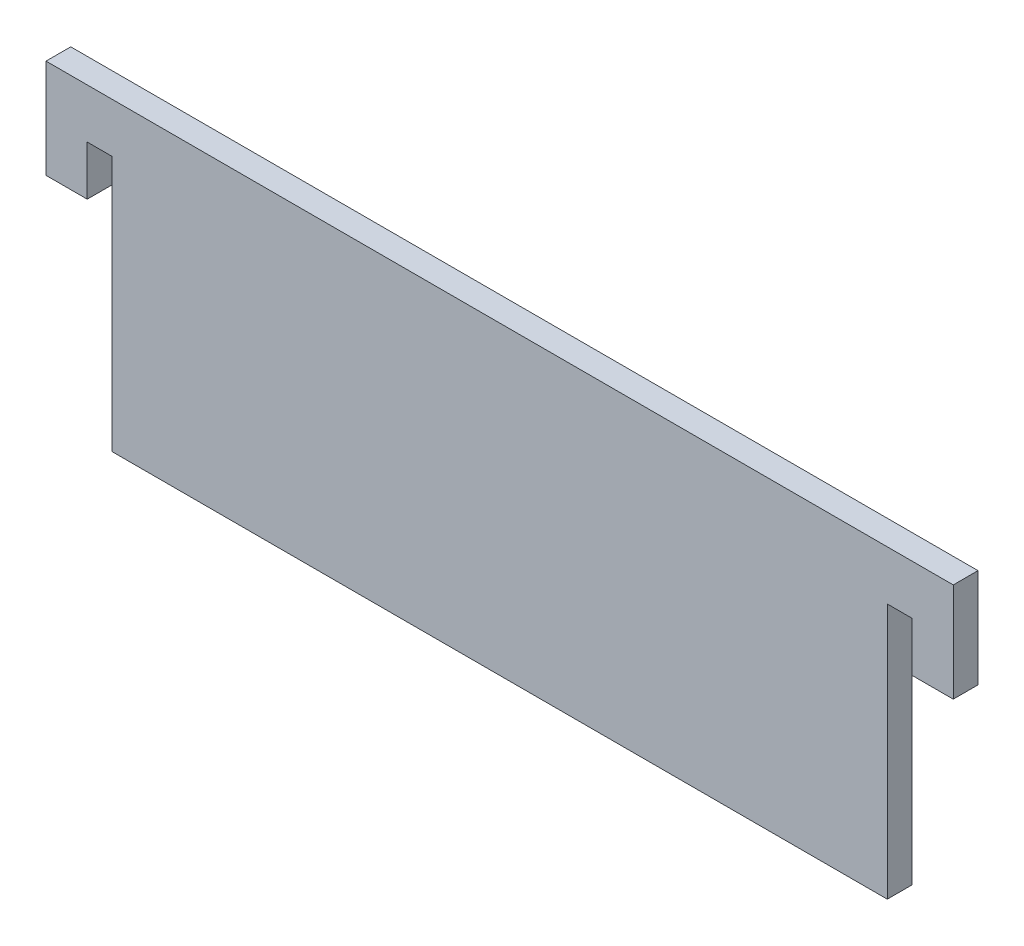
ISO-10303-21;
HEADER;
FILE_DESCRIPTION(('STEP AP214'),'2;1');
FILE_NAME('part.step','',(''),(''),'','','');
FILE_SCHEMA(('AUTOMOTIVE_DESIGN { 1 0 10303 214 1 1 1 1 }'));
ENDSEC;
DATA;
#1=APPLICATION_CONTEXT('core data for automotive mechanical design processes');
#2=APPLICATION_PROTOCOL_DEFINITION('international standard','automotive_design',2000,#1);
#3=PRODUCT_CONTEXT('',#1,'mechanical');
#4=PRODUCT('Part','Part','',(#3));
#5=PRODUCT_RELATED_PRODUCT_CATEGORY('part','',(#4));
#6=PRODUCT_DEFINITION_FORMATION('','',#4);
#7=PRODUCT_DEFINITION_CONTEXT('part definition',#1,'design');
#8=PRODUCT_DEFINITION('design','',#6,#7);
#9=PRODUCT_DEFINITION_SHAPE('','',#8);
#10=(LENGTH_UNIT() NAMED_UNIT(*) SI_UNIT(.MILLI.,.METRE.));
#11=(NAMED_UNIT(*) PLANE_ANGLE_UNIT() SI_UNIT($,.RADIAN.));
#12=(NAMED_UNIT(*) SI_UNIT($,.STERADIAN.) SOLID_ANGLE_UNIT());
#13=UNCERTAINTY_MEASURE_WITH_UNIT(LENGTH_MEASURE(1.E-05),#10,'distance_accuracy_value','');
#14=(GEOMETRIC_REPRESENTATION_CONTEXT(3) GLOBAL_UNCERTAINTY_ASSIGNED_CONTEXT((#13)) GLOBAL_UNIT_ASSIGNED_CONTEXT((#10,
#11,#12)) REPRESENTATION_CONTEXT('',''));
#15=CARTESIAN_POINT('',(0.,0.,0.));
#16=DIRECTION('',(0.,0.,1.));
#17=DIRECTION('',(1.,0.,0.));
#18=AXIS2_PLACEMENT_3D('',#15,#16,#17);
#19=CARTESIAN_POINT('',(-1.0429380677152E-13,15.4597593373967,3.));
#20=DIRECTION('',(0.,1.,0.));
#21=DIRECTION('',(-1.,0.,0.));
#22=AXIS2_PLACEMENT_3D('',#19,#20,#21);
#23=PLANE('',#22);
#24=DIRECTION('',(1.,0.,0.));
#25=VECTOR('',#24,1.);
#26=CARTESIAN_POINT('',(-1.0429380677152E-13,15.4597593373967,0.));
#27=LINE('',#26,#25);
#28=CARTESIAN_POINT('',(-46.7371115714815,15.4597593373964,0.));
#29=VERTEX_POINT('',#28);
#30=CARTESIAN_POINT('',(63.2628884285185,15.4597593373964,0.));
#31=VERTEX_POINT('',#30);
#32=EDGE_CURVE('E92',#29,#31,#27,.T.);
#33=ORIENTED_EDGE('',*,*,#32,.F.);
#34=DIRECTION('',(0.,0.,1.));
#35=VECTOR('',#34,1.);
#36=CARTESIAN_POINT('',(-46.7371115714815,15.4597593373964,0.));
#37=LINE('',#36,#35);
#38=CARTESIAN_POINT('',(-46.7371115714815,15.4597593373964,3.));
#39=VERTEX_POINT('',#38);
#40=EDGE_CURVE('E104',#29,#39,#37,.T.);
#41=ORIENTED_EDGE('',*,*,#40,.T.);
#42=DIRECTION('',(1.,0.,0.));
#43=VECTOR('',#42,1.);
#44=CARTESIAN_POINT('',(-1.13233275923364E-13,15.4597593373967,3.));
#45=LINE('',#44,#43);
#46=CARTESIAN_POINT('',(63.2628884285185,15.4597593373964,3.));
#47=VERTEX_POINT('',#46);
#48=EDGE_CURVE('E11',#39,#47,#45,.T.);
#49=ORIENTED_EDGE('',*,*,#48,.T.);
#50=DIRECTION('',(0.,0.,1.));
#51=VECTOR('',#50,1.);
#52=CARTESIAN_POINT('',(63.2628884285185,15.4597593373964,0.));
#53=LINE('',#52,#51);
#54=EDGE_CURVE('E99',#31,#47,#53,.T.);
#55=ORIENTED_EDGE('',*,*,#54,.F.);
#56=EDGE_LOOP('',(#33,#41,#49,#55));
#57=FACE_BOUND('',#56,.T.);
#58=ADVANCED_FACE('F35',(#57),#23,.T.);
#59=CARTESIAN_POINT('',(1.49465444622433E-13,-21.5402406626033,3.));
#60=DIRECTION('',(0.,1.,0.));
#61=DIRECTION('',(-1.,0.,0.));
#62=AXIS2_PLACEMENT_3D('',#59,#60,#61);
#63=PLANE('',#62);
#64=DIRECTION('',(1.,0.,0.));
#65=VECTOR('',#64,1.);
#66=CARTESIAN_POINT('',(1.41161808810075E-13,-21.5402406626033,3.));
#67=LINE('',#66,#65);
#68=CARTESIAN_POINT('',(-38.7371115714812,-21.5402406626036,3.));
#69=VERTEX_POINT('',#68);
#70=CARTESIAN_POINT('',(55.2628884285188,-21.5402406626036,3.));
#71=VERTEX_POINT('',#70);
#72=EDGE_CURVE('E44',#69,#71,#67,.T.);
#73=ORIENTED_EDGE('',*,*,#72,.F.);
#74=DIRECTION('',(0.,0.,1.));
#75=VECTOR('',#74,1.);
#76=CARTESIAN_POINT('',(-38.7371115714812,-21.5402406626036,0.));
#77=LINE('',#76,#75);
#78=CARTESIAN_POINT('',(-38.7371115714812,-21.5402406626036,0.));
#79=VERTEX_POINT('',#78);
#80=EDGE_CURVE('E125',#79,#69,#77,.T.);
#81=ORIENTED_EDGE('',*,*,#80,.F.);
#82=DIRECTION('',(1.,0.,0.));
#83=VECTOR('',#82,1.);
#84=CARTESIAN_POINT('',(1.49465444622433E-13,-21.5402406626033,0.));
#85=LINE('',#84,#83);
#86=CARTESIAN_POINT('',(55.2628884285188,-21.5402406626036,0.));
#87=VERTEX_POINT('',#86);
#88=EDGE_CURVE('E38',#79,#87,#85,.T.);
#89=ORIENTED_EDGE('',*,*,#88,.T.);
#90=DIRECTION('',(0.,0.,1.));
#91=VECTOR('',#90,1.);
#92=CARTESIAN_POINT('',(55.2628884285188,-21.5402406626036,0.));
#93=LINE('',#92,#91);
#94=EDGE_CURVE('E86',#87,#71,#93,.T.);
#95=ORIENTED_EDGE('',*,*,#94,.T.);
#96=EDGE_LOOP('',(#73,#81,#89,#95));
#97=FACE_BOUND('',#96,.T.);
#98=ADVANCED_FACE('F120',(#97),#63,.F.);
#99=CARTESIAN_POINT('',(0.,0.,3.));
#100=DIRECTION('',(0.,0.,1.));
#101=DIRECTION('',(1.,0.,0.));
#102=AXIS2_PLACEMENT_3D('',#99,#100,#101);
#103=PLANE('',#102);
#104=DIRECTION('',(0.,-1.,0.));
#105=VECTOR('',#104,1.);
#106=CARTESIAN_POINT('',(-41.7371115714812,-21.5402406626036,3.));
#107=LINE('',#106,#105);
#108=CARTESIAN_POINT('',(-41.7371115714809,9.45975933739638,3.));
#109=VERTEX_POINT('',#108);
#110=CARTESIAN_POINT('',(-41.7371115714812,3.45975933739637,3.));
#111=VERTEX_POINT('',#110);
#112=EDGE_CURVE('E71',#109,#111,#107,.T.);
#113=ORIENTED_EDGE('',*,*,#112,.F.);
#114=DIRECTION('',(-1.,0.,0.));
#115=VECTOR('',#114,1.);
#116=CARTESIAN_POINT('',(-41.7371115714809,9.45975933739638,3.));
#117=LINE('',#116,#115);
#118=CARTESIAN_POINT('',(-38.7371115714809,9.45975933739638,3.));
#119=VERTEX_POINT('',#118);
#120=EDGE_CURVE('E230',#119,#109,#117,.T.);
#121=ORIENTED_EDGE('',*,*,#120,.F.);
#122=DIRECTION('',(0.,1.,0.));
#123=VECTOR('',#122,1.);
#124=CARTESIAN_POINT('',(-38.7371115714812,-21.5402406626036,3.));
#125=LINE('',#124,#123);
#126=EDGE_CURVE('E85',#69,#119,#125,.T.);
#127=ORIENTED_EDGE('',*,*,#126,.F.);
#128=ORIENTED_EDGE('',*,*,#72,.T.);
#129=DIRECTION('',(0.,-1.,0.));
#130=VECTOR('',#129,1.);
#131=CARTESIAN_POINT('',(55.2628884285188,-21.5402406626036,3.));
#132=LINE('',#131,#130);
#133=CARTESIAN_POINT('',(55.2628884285185,9.45975933739638,3.));
#134=VERTEX_POINT('',#133);
#135=EDGE_CURVE('E212',#134,#71,#132,.T.);
#136=ORIENTED_EDGE('',*,*,#135,.F.);
#137=DIRECTION('',(-1.,0.,0.));
#138=VECTOR('',#137,1.);
#139=CARTESIAN_POINT('',(58.2628884285185,9.45975933739638,3.));
#140=LINE('',#139,#138);
#141=CARTESIAN_POINT('',(58.2628884285185,9.45975933739638,3.));
#142=VERTEX_POINT('',#141);
#143=EDGE_CURVE('E215',#142,#134,#140,.T.);
#144=ORIENTED_EDGE('',*,*,#143,.F.);
#145=DIRECTION('',(0.,1.,0.));
#146=VECTOR('',#145,1.);
#147=CARTESIAN_POINT('',(58.2628884285188,-21.5402406626036,3.));
#148=LINE('',#147,#146);
#149=CARTESIAN_POINT('',(58.2628884285186,3.45975933739639,3.));
#150=VERTEX_POINT('',#149);
#151=EDGE_CURVE('E218',#150,#142,#148,.T.);
#152=ORIENTED_EDGE('',*,*,#151,.F.);
#153=DIRECTION('',(1.,0.,0.));
#154=VECTOR('',#153,1.);
#155=CARTESIAN_POINT('',(58.2628884285188,3.45975933739638,3.));
#156=LINE('',#155,#154);
#157=CARTESIAN_POINT('',(63.2628884285185,3.45975933739641,3.));
#158=VERTEX_POINT('',#157);
#159=EDGE_CURVE('E193',#150,#158,#156,.T.);
#160=ORIENTED_EDGE('',*,*,#159,.T.);
#161=DIRECTION('',(0.,1.,0.));
#162=VECTOR('',#161,1.);
#163=CARTESIAN_POINT('',(63.2628884285185,15.4597593373964,3.));
#164=LINE('',#163,#162);
#165=EDGE_CURVE('E186',#158,#47,#164,.T.);
#166=ORIENTED_EDGE('',*,*,#165,.T.);
#167=ORIENTED_EDGE('',*,*,#48,.F.);
#168=DIRECTION('',(0.,-1.,0.));
#169=VECTOR('',#168,1.);
#170=CARTESIAN_POINT('',(-46.7371115714815,15.4597593373964,3.));
#171=LINE('',#170,#169);
#172=CARTESIAN_POINT('',(-46.7371115714815,3.4597593373964,3.));
#173=VERTEX_POINT('',#172);
#174=EDGE_CURVE('E95',#39,#173,#171,.T.);
#175=ORIENTED_EDGE('',*,*,#174,.T.);
#176=DIRECTION('',(1.,0.,0.));
#177=VECTOR('',#176,1.);
#178=CARTESIAN_POINT('',(-41.7371115714812,3.45975933739637,3.));
#179=LINE('',#178,#177);
#180=EDGE_CURVE('E89',#173,#111,#179,.T.);
#181=ORIENTED_EDGE('',*,*,#180,.T.);
#182=EDGE_LOOP('',(#113,#121,#127,#128,#136,#144,#152,#160,#166,#167,#175,#181));
#183=FACE_BOUND('',#182,.T.);
#184=ADVANCED_FACE('F94',(#183),#103,.T.);
#185=CARTESIAN_POINT('',(0.,0.,0.));
#186=DIRECTION('',(0.,0.,1.));
#187=DIRECTION('',(1.,0.,0.));
#188=AXIS2_PLACEMENT_3D('',#185,#186,#187);
#189=PLANE('',#188);
#190=DIRECTION('',(-1.,0.,0.));
#191=VECTOR('',#190,1.);
#192=CARTESIAN_POINT('',(-41.7371115714809,9.45975933739638,0.));
#193=LINE('',#192,#191);
#194=CARTESIAN_POINT('',(-38.7371115714809,9.45975933739638,0.));
#195=VERTEX_POINT('',#194);
#196=CARTESIAN_POINT('',(-41.7371115714809,9.45975933739638,0.));
#197=VERTEX_POINT('',#196);
#198=EDGE_CURVE('E227',#195,#197,#193,.T.);
#199=ORIENTED_EDGE('',*,*,#198,.T.);
#200=DIRECTION('',(0.,-1.,0.));
#201=VECTOR('',#200,1.);
#202=CARTESIAN_POINT('',(-41.7371115714812,-21.5402406626036,0.));
#203=LINE('',#202,#201);
#204=CARTESIAN_POINT('',(-41.737111571481,3.45975933739637,0.));
#205=VERTEX_POINT('',#204);
#206=EDGE_CURVE('E232',#197,#205,#203,.T.);
#207=ORIENTED_EDGE('',*,*,#206,.T.);
#208=DIRECTION('',(1.,0.,0.));
#209=VECTOR('',#208,1.);
#210=CARTESIAN_POINT('',(-41.7371115714812,3.45975933739637,0.));
#211=LINE('',#210,#209);
#212=CARTESIAN_POINT('',(-46.7371115714815,3.4597593373964,0.));
#213=VERTEX_POINT('',#212);
#214=EDGE_CURVE('E91',#213,#205,#211,.T.);
#215=ORIENTED_EDGE('',*,*,#214,.F.);
#216=DIRECTION('',(0.,-1.,0.));
#217=VECTOR('',#216,1.);
#218=CARTESIAN_POINT('',(-46.7371115714815,15.4597593373964,0.));
#219=LINE('',#218,#217);
#220=EDGE_CURVE('E96',#29,#213,#219,.T.);
#221=ORIENTED_EDGE('',*,*,#220,.F.);
#222=ORIENTED_EDGE('',*,*,#32,.T.);
#223=DIRECTION('',(0.,1.,0.));
#224=VECTOR('',#223,1.);
#225=CARTESIAN_POINT('',(63.2628884285185,15.4597593373964,0.));
#226=LINE('',#225,#224);
#227=CARTESIAN_POINT('',(63.2628884285185,3.45975933739641,0.));
#228=VERTEX_POINT('',#227);
#229=EDGE_CURVE('E188',#228,#31,#226,.T.);
#230=ORIENTED_EDGE('',*,*,#229,.F.);
#231=DIRECTION('',(1.,0.,0.));
#232=VECTOR('',#231,1.);
#233=CARTESIAN_POINT('',(58.2628884285188,3.45975933739638,0.));
#234=LINE('',#233,#232);
#235=CARTESIAN_POINT('',(58.2628884285188,3.45975933739638,0.));
#236=VERTEX_POINT('',#235);
#237=EDGE_CURVE('E194',#236,#228,#234,.T.);
#238=ORIENTED_EDGE('',*,*,#237,.F.);
#239=DIRECTION('',(0.,1.,0.));
#240=VECTOR('',#239,1.);
#241=CARTESIAN_POINT('',(58.2628884285188,-21.5402406626036,0.));
#242=LINE('',#241,#240);
#243=CARTESIAN_POINT('',(58.2628884285185,9.45975933739638,0.));
#244=VERTEX_POINT('',#243);
#245=EDGE_CURVE('E214',#236,#244,#242,.T.);
#246=ORIENTED_EDGE('',*,*,#245,.T.);
#247=DIRECTION('',(-1.,0.,0.));
#248=VECTOR('',#247,1.);
#249=CARTESIAN_POINT('',(58.2628884285185,9.45975933739638,0.));
#250=LINE('',#249,#248);
#251=CARTESIAN_POINT('',(55.2628884285185,9.45975933739638,0.));
#252=VERTEX_POINT('',#251);
#253=EDGE_CURVE('E221',#244,#252,#250,.T.);
#254=ORIENTED_EDGE('',*,*,#253,.T.);
#255=DIRECTION('',(0.,-1.,0.));
#256=VECTOR('',#255,1.);
#257=CARTESIAN_POINT('',(55.2628884285188,-21.5402406626036,0.));
#258=LINE('',#257,#256);
#259=EDGE_CURVE('E138',#252,#87,#258,.T.);
#260=ORIENTED_EDGE('',*,*,#259,.T.);
#261=ORIENTED_EDGE('',*,*,#88,.F.);
#262=DIRECTION('',(0.,1.,0.));
#263=VECTOR('',#262,1.);
#264=CARTESIAN_POINT('',(-38.7371115714812,-21.5402406626036,0.));
#265=LINE('',#264,#263);
#266=EDGE_CURVE('E135',#79,#195,#265,.T.);
#267=ORIENTED_EDGE('',*,*,#266,.T.);
#268=EDGE_LOOP('',(#199,#207,#215,#221,#222,#230,#238,#246,#254,#260,#261,#267));
#269=FACE_BOUND('',#268,.T.);
#270=ADVANCED_FACE('F132',(#269),#189,.F.);
#271=CARTESIAN_POINT('',(-41.7371115714812,3.45975933739637,0.));
#272=DIRECTION('',(0.,-1.,0.));
#273=DIRECTION('',(1.,0.,0.));
#274=AXIS2_PLACEMENT_3D('',#271,#272,#273);
#275=PLANE('',#274);
#276=ORIENTED_EDGE('',*,*,#180,.F.);
#277=DIRECTION('',(0.,0.,1.));
#278=VECTOR('',#277,1.);
#279=CARTESIAN_POINT('',(-46.7371115714815,3.4597593373964,0.));
#280=LINE('',#279,#278);
#281=EDGE_CURVE('E53',#213,#173,#280,.T.);
#282=ORIENTED_EDGE('',*,*,#281,.F.);
#283=ORIENTED_EDGE('',*,*,#214,.T.);
#284=DIRECTION('',(0.,0.,1.));
#285=VECTOR('',#284,1.);
#286=CARTESIAN_POINT('',(-41.7371115714812,3.45975933739637,0.));
#287=LINE('',#286,#285);
#288=EDGE_CURVE('E76',#205,#111,#287,.T.);
#289=ORIENTED_EDGE('',*,*,#288,.T.);
#290=EDGE_LOOP('',(#276,#282,#283,#289));
#291=FACE_BOUND('',#290,.T.);
#292=ADVANCED_FACE('F88',(#291),#275,.T.);
#293=CARTESIAN_POINT('',(-46.7371115714815,15.4597593373964,0.));
#294=DIRECTION('',(-1.,0.,0.));
#295=DIRECTION('',(0.,-1.,0.));
#296=AXIS2_PLACEMENT_3D('',#293,#294,#295);
#297=PLANE('',#296);
#298=ORIENTED_EDGE('',*,*,#174,.F.);
#299=ORIENTED_EDGE('',*,*,#40,.F.);
#300=ORIENTED_EDGE('',*,*,#220,.T.);
#301=ORIENTED_EDGE('',*,*,#281,.T.);
#302=EDGE_LOOP('',(#298,#299,#300,#301));
#303=FACE_BOUND('',#302,.T.);
#304=ADVANCED_FACE('F261',(#303),#297,.T.);
#305=CARTESIAN_POINT('',(63.2628884285185,15.4597593373964,0.));
#306=DIRECTION('',(1.,0.,0.));
#307=DIRECTION('',(0.,1.,0.));
#308=AXIS2_PLACEMENT_3D('',#305,#306,#307);
#309=PLANE('',#308);
#310=ORIENTED_EDGE('',*,*,#165,.F.);
#311=DIRECTION('',(0.,0.,1.));
#312=VECTOR('',#311,1.);
#313=CARTESIAN_POINT('',(63.2628884285185,3.45975933739641,0.));
#314=LINE('',#313,#312);
#315=EDGE_CURVE('E189',#228,#158,#314,.T.);
#316=ORIENTED_EDGE('',*,*,#315,.F.);
#317=ORIENTED_EDGE('',*,*,#229,.T.);
#318=ORIENTED_EDGE('',*,*,#54,.T.);
#319=EDGE_LOOP('',(#310,#316,#317,#318));
#320=FACE_BOUND('',#319,.T.);
#321=ADVANCED_FACE('F185',(#320),#309,.T.);
#322=CARTESIAN_POINT('',(58.2628884285188,3.45975933739638,0.));
#323=DIRECTION('',(0.,-1.,0.));
#324=DIRECTION('',(1.,0.,0.));
#325=AXIS2_PLACEMENT_3D('',#322,#323,#324);
#326=PLANE('',#325);
#327=ORIENTED_EDGE('',*,*,#159,.F.);
#328=DIRECTION('',(0.,0.,1.));
#329=VECTOR('',#328,1.);
#330=CARTESIAN_POINT('',(58.2628884285188,3.45975933739638,0.));
#331=LINE('',#330,#329);
#332=EDGE_CURVE('E202',#236,#150,#331,.T.);
#333=ORIENTED_EDGE('',*,*,#332,.F.);
#334=ORIENTED_EDGE('',*,*,#237,.T.);
#335=ORIENTED_EDGE('',*,*,#315,.T.);
#336=EDGE_LOOP('',(#327,#333,#334,#335));
#337=FACE_BOUND('',#336,.T.);
#338=ADVANCED_FACE('F266',(#337),#326,.T.);
#339=CARTESIAN_POINT('',(58.2628884285188,-21.5402406626036,0.));
#340=DIRECTION('',(1.,0.,0.));
#341=DIRECTION('',(0.,1.,0.));
#342=AXIS2_PLACEMENT_3D('',#339,#340,#341);
#343=PLANE('',#342);
#344=ORIENTED_EDGE('',*,*,#332,.T.);
#345=ORIENTED_EDGE('',*,*,#151,.T.);
#346=DIRECTION('',(0.,0.,1.));
#347=VECTOR('',#346,1.);
#348=CARTESIAN_POINT('',(58.2628884285185,9.45975933739638,0.));
#349=LINE('',#348,#347);
#350=EDGE_CURVE('E206',#244,#142,#349,.T.);
#351=ORIENTED_EDGE('',*,*,#350,.F.);
#352=ORIENTED_EDGE('',*,*,#245,.F.);
#353=EDGE_LOOP('',(#344,#345,#351,#352));
#354=FACE_BOUND('',#353,.T.);
#355=ADVANCED_FACE('F269',(#354),#343,.F.);
#356=CARTESIAN_POINT('',(55.2628884285188,-21.5402406626036,0.));
#357=DIRECTION('',(-1.,0.,0.));
#358=DIRECTION('',(0.,-1.,0.));
#359=AXIS2_PLACEMENT_3D('',#356,#357,#358);
#360=PLANE('',#359);
#361=ORIENTED_EDGE('',*,*,#135,.T.);
#362=ORIENTED_EDGE('',*,*,#94,.F.);
#363=ORIENTED_EDGE('',*,*,#259,.F.);
#364=DIRECTION('',(0.,0.,1.));
#365=VECTOR('',#364,1.);
#366=CARTESIAN_POINT('',(55.2628884285185,9.45975933739638,0.));
#367=LINE('',#366,#365);
#368=EDGE_CURVE('E209',#252,#134,#367,.T.);
#369=ORIENTED_EDGE('',*,*,#368,.T.);
#370=EDGE_LOOP('',(#361,#362,#363,#369));
#371=FACE_BOUND('',#370,.T.);
#372=ADVANCED_FACE('F275',(#371),#360,.F.);
#373=CARTESIAN_POINT('',(58.2628884285185,9.45975933739638,0.));
#374=DIRECTION('',(0.,1.,0.));
#375=DIRECTION('',(0.,0.,1.));
#376=AXIS2_PLACEMENT_3D('',#373,#374,#375);
#377=PLANE('',#376);
#378=ORIENTED_EDGE('',*,*,#143,.T.);
#379=ORIENTED_EDGE('',*,*,#368,.F.);
#380=ORIENTED_EDGE('',*,*,#253,.F.);
#381=ORIENTED_EDGE('',*,*,#350,.T.);
#382=EDGE_LOOP('',(#378,#379,#380,#381));
#383=FACE_BOUND('',#382,.T.);
#384=ADVANCED_FACE('F276',(#383),#377,.F.);
#385=CARTESIAN_POINT('',(-41.7371115714812,-21.5402406626036,0.));
#386=DIRECTION('',(-1.,0.,0.));
#387=DIRECTION('',(0.,-1.,0.));
#388=AXIS2_PLACEMENT_3D('',#385,#386,#387);
#389=PLANE('',#388);
#390=ORIENTED_EDGE('',*,*,#288,.F.);
#391=ORIENTED_EDGE('',*,*,#206,.F.);
#392=DIRECTION('',(0.,0.,1.));
#393=VECTOR('',#392,1.);
#394=CARTESIAN_POINT('',(-41.7371115714809,9.45975933739638,0.));
#395=LINE('',#394,#393);
#396=EDGE_CURVE('E80',#197,#109,#395,.T.);
#397=ORIENTED_EDGE('',*,*,#396,.T.);
#398=ORIENTED_EDGE('',*,*,#112,.T.);
#399=EDGE_LOOP('',(#390,#391,#397,#398));
#400=FACE_BOUND('',#399,.T.);
#401=ADVANCED_FACE('F73',(#400),#389,.F.);
#402=CARTESIAN_POINT('',(-41.7371115714809,9.45975933739638,0.));
#403=DIRECTION('',(0.,1.,0.));
#404=DIRECTION('',(0.,0.,1.));
#405=AXIS2_PLACEMENT_3D('',#402,#403,#404);
#406=PLANE('',#405);
#407=ORIENTED_EDGE('',*,*,#120,.T.);
#408=ORIENTED_EDGE('',*,*,#396,.F.);
#409=ORIENTED_EDGE('',*,*,#198,.F.);
#410=DIRECTION('',(0.,0.,1.));
#411=VECTOR('',#410,1.);
#412=CARTESIAN_POINT('',(-38.7371115714809,9.45975933739638,0.));
#413=LINE('',#412,#411);
#414=EDGE_CURVE('E226',#195,#119,#413,.T.);
#415=ORIENTED_EDGE('',*,*,#414,.T.);
#416=EDGE_LOOP('',(#407,#408,#409,#415));
#417=FACE_BOUND('',#416,.T.);
#418=ADVANCED_FACE('F239',(#417),#406,.F.);
#419=CARTESIAN_POINT('',(-38.7371115714812,-21.5402406626036,0.));
#420=DIRECTION('',(1.,0.,0.));
#421=DIRECTION('',(0.,1.,0.));
#422=AXIS2_PLACEMENT_3D('',#419,#420,#421);
#423=PLANE('',#422);
#424=ORIENTED_EDGE('',*,*,#126,.T.);
#425=ORIENTED_EDGE('',*,*,#414,.F.);
#426=ORIENTED_EDGE('',*,*,#266,.F.);
#427=ORIENTED_EDGE('',*,*,#80,.T.);
#428=EDGE_LOOP('',(#424,#425,#426,#427));
#429=FACE_BOUND('',#428,.T.);
#430=ADVANCED_FACE('F242',(#429),#423,.F.);
#431=CLOSED_SHELL('',(#58,#98,#184,#270,#292,#304,#321,#338,#355,#372,#384,#401,#418,#430));
#432=MANIFOLD_SOLID_BREP('B2',#431);
#433=ADVANCED_BREP_SHAPE_REPRESENTATION('',(#18,#432),#14);
#434=SHAPE_DEFINITION_REPRESENTATION(#9,#433);
ENDSEC;
END-ISO-10303-21;
